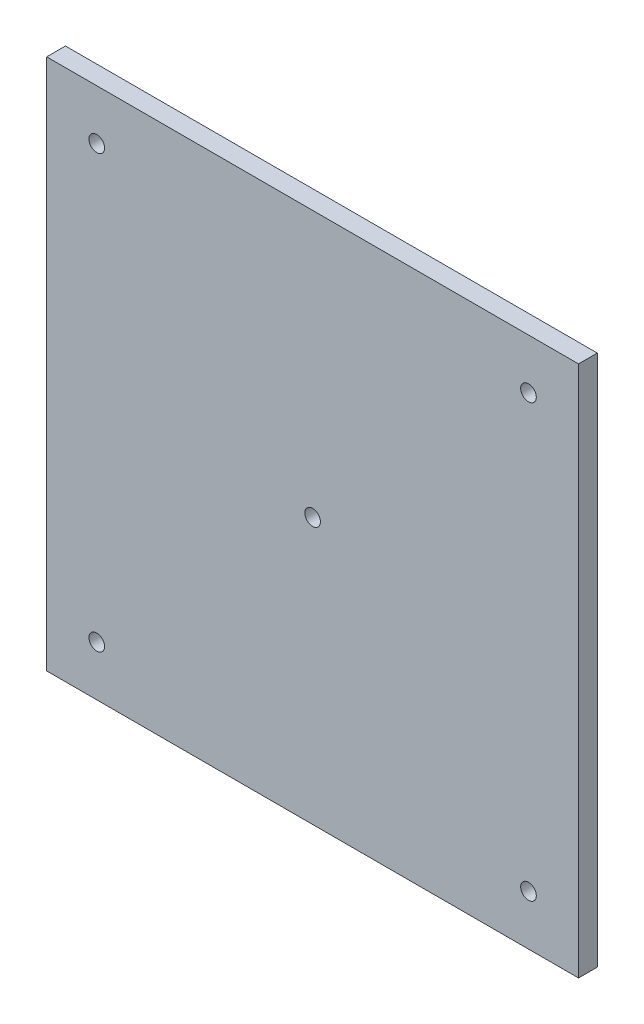
ISO-10303-21;
HEADER;
FILE_DESCRIPTION(('STEP AP214'),'2;1');
FILE_NAME('part.step','',(''),(''),'','','');
FILE_SCHEMA(('AUTOMOTIVE_DESIGN { 1 0 10303 214 1 1 1 1 }'));
ENDSEC;
DATA;
#1=APPLICATION_CONTEXT('core data for automotive mechanical design processes');
#2=APPLICATION_PROTOCOL_DEFINITION('international standard','automotive_design',2000,#1);
#3=PRODUCT_CONTEXT('',#1,'mechanical');
#4=PRODUCT('Part','Part','',(#3));
#5=PRODUCT_RELATED_PRODUCT_CATEGORY('part','',(#4));
#6=PRODUCT_DEFINITION_FORMATION('','',#4);
#7=PRODUCT_DEFINITION_CONTEXT('part definition',#1,'design');
#8=PRODUCT_DEFINITION('design','',#6,#7);
#9=PRODUCT_DEFINITION_SHAPE('','',#8);
#10=(LENGTH_UNIT() NAMED_UNIT(*) SI_UNIT(.MILLI.,.METRE.));
#11=(NAMED_UNIT(*) PLANE_ANGLE_UNIT() SI_UNIT($,.RADIAN.));
#12=(NAMED_UNIT(*) SI_UNIT($,.STERADIAN.) SOLID_ANGLE_UNIT());
#13=UNCERTAINTY_MEASURE_WITH_UNIT(LENGTH_MEASURE(1.E-05),#10,'distance_accuracy_value','');
#14=(GEOMETRIC_REPRESENTATION_CONTEXT(3) GLOBAL_UNCERTAINTY_ASSIGNED_CONTEXT((#13)) GLOBAL_UNIT_ASSIGNED_CONTEXT((#10,
#11,#12)) REPRESENTATION_CONTEXT('',''));
#15=CARTESIAN_POINT('',(0.,0.,0.));
#16=DIRECTION('',(0.,0.,1.));
#17=DIRECTION('',(1.,0.,0.));
#18=AXIS2_PLACEMENT_3D('',#15,#16,#17);
#19=CARTESIAN_POINT('',(-32.6124622832805,19.1999861446117,3.));
#20=DIRECTION('',(1.,0.,0.));
#21=DIRECTION('',(0.,1.,0.));
#22=AXIS2_PLACEMENT_3D('',#19,#20,#21);
#23=PLANE('',#22);
#24=DIRECTION('',(0.,-1.,0.));
#25=VECTOR('',#24,1.);
#26=CARTESIAN_POINT('',(-32.6124622832805,19.1999861446117,0.));
#27=LINE('',#26,#25);
#28=CARTESIAN_POINT('',(-32.6124622832805,19.1999861446117,0.));
#29=VERTEX_POINT('',#28);
#30=CARTESIAN_POINT('',(-32.6124622832805,-65.8000138553883,0.));
#31=VERTEX_POINT('',#30);
#32=EDGE_CURVE('E98',#29,#31,#27,.T.);
#33=ORIENTED_EDGE('',*,*,#32,.T.);
#34=DIRECTION('',(0.,0.,-1.));
#35=VECTOR('',#34,1.);
#36=CARTESIAN_POINT('',(-32.6124622832805,-65.8000138553883,3.));
#37=LINE('',#36,#35);
#38=CARTESIAN_POINT('',(-32.6124622832805,-65.8000138553883,3.));
#39=VERTEX_POINT('',#38);
#40=EDGE_CURVE('E11',#39,#31,#37,.T.);
#41=ORIENTED_EDGE('',*,*,#40,.F.);
#42=DIRECTION('',(0.,-1.,0.));
#43=VECTOR('',#42,1.);
#44=CARTESIAN_POINT('',(-32.6124622832805,19.1999861446117,3.));
#45=LINE('',#44,#43);
#46=CARTESIAN_POINT('',(-32.6124622832805,19.1999861446117,3.));
#47=VERTEX_POINT('',#46);
#48=EDGE_CURVE('E85',#47,#39,#45,.T.);
#49=ORIENTED_EDGE('',*,*,#48,.F.);
#50=DIRECTION('',(0.,0.,-1.));
#51=VECTOR('',#50,1.);
#52=CARTESIAN_POINT('',(-32.6124622832805,19.1999861446117,3.));
#53=LINE('',#52,#51);
#54=EDGE_CURVE('E94',#47,#29,#53,.T.);
#55=ORIENTED_EDGE('',*,*,#54,.T.);
#56=EDGE_LOOP('',(#33,#41,#49,#55));
#57=FACE_BOUND('',#56,.T.);
#58=ADVANCED_FACE('F33',(#57),#23,.F.);
#59=CARTESIAN_POINT('',(-32.6124622832805,-65.8000138553883,3.));
#60=DIRECTION('',(0.,1.,0.));
#61=DIRECTION('',(0.,0.,1.));
#62=AXIS2_PLACEMENT_3D('',#59,#60,#61);
#63=PLANE('',#62);
#64=DIRECTION('',(1.,0.,0.));
#65=VECTOR('',#64,1.);
#66=CARTESIAN_POINT('',(-32.6124622832805,-65.8000138553883,0.));
#67=LINE('',#66,#65);
#68=CARTESIAN_POINT('',(52.3875377167195,-65.8000138553883,0.));
#69=VERTEX_POINT('',#68);
#70=EDGE_CURVE('E89',#31,#69,#67,.T.);
#71=ORIENTED_EDGE('',*,*,#70,.T.);
#72=DIRECTION('',(0.,0.,-1.));
#73=VECTOR('',#72,1.);
#74=CARTESIAN_POINT('',(52.3875377167195,-65.8000138553883,3.));
#75=LINE('',#74,#73);
#76=CARTESIAN_POINT('',(52.3875377167195,-65.8000138553883,3.));
#77=VERTEX_POINT('',#76);
#78=EDGE_CURVE('E42',#77,#69,#75,.T.);
#79=ORIENTED_EDGE('',*,*,#78,.F.);
#80=DIRECTION('',(1.,0.,0.));
#81=VECTOR('',#80,1.);
#82=CARTESIAN_POINT('',(-32.6124622832805,-65.8000138553883,3.));
#83=LINE('',#82,#81);
#84=EDGE_CURVE('E80',#39,#77,#83,.T.);
#85=ORIENTED_EDGE('',*,*,#84,.F.);
#86=ORIENTED_EDGE('',*,*,#40,.T.);
#87=EDGE_LOOP('',(#71,#79,#85,#86));
#88=FACE_BOUND('',#87,.T.);
#89=ADVANCED_FACE('F88',(#88),#63,.F.);
#90=CARTESIAN_POINT('',(52.3875377167195,19.1999861446117,3.));
#91=DIRECTION('',(-1.,0.,0.));
#92=DIRECTION('',(0.,-1.,0.));
#93=AXIS2_PLACEMENT_3D('',#90,#91,#92);
#94=PLANE('',#93);
#95=DIRECTION('',(0.,1.,0.));
#96=VECTOR('',#95,1.);
#97=CARTESIAN_POINT('',(52.3875377167195,19.1999861446117,0.));
#98=LINE('',#97,#96);
#99=CARTESIAN_POINT('',(52.3875377167195,19.1999861446117,0.));
#100=VERTEX_POINT('',#99);
#101=EDGE_CURVE('E67',#69,#100,#98,.T.);
#102=ORIENTED_EDGE('',*,*,#101,.T.);
#103=DIRECTION('',(0.,0.,-1.));
#104=VECTOR('',#103,1.);
#105=CARTESIAN_POINT('',(52.3875377167195,19.1999861446117,3.));
#106=LINE('',#105,#104);
#107=CARTESIAN_POINT('',(52.3875377167195,19.1999861446117,3.));
#108=VERTEX_POINT('',#107);
#109=EDGE_CURVE('E90',#108,#100,#106,.T.);
#110=ORIENTED_EDGE('',*,*,#109,.F.);
#111=DIRECTION('',(0.,1.,0.));
#112=VECTOR('',#111,1.);
#113=CARTESIAN_POINT('',(52.3875377167195,19.1999861446117,3.));
#114=LINE('',#113,#112);
#115=EDGE_CURVE('E83',#77,#108,#114,.T.);
#116=ORIENTED_EDGE('',*,*,#115,.F.);
#117=ORIENTED_EDGE('',*,*,#78,.T.);
#118=EDGE_LOOP('',(#102,#110,#116,#117));
#119=FACE_BOUND('',#118,.T.);
#120=ADVANCED_FACE('F92',(#119),#94,.F.);
#121=CARTESIAN_POINT('',(-32.6124622832805,19.1999861446117,3.));
#122=DIRECTION('',(0.,-1.,0.));
#123=DIRECTION('',(0.,0.,-1.));
#124=AXIS2_PLACEMENT_3D('',#121,#122,#123);
#125=PLANE('',#124);
#126=DIRECTION('',(-1.,0.,0.));
#127=VECTOR('',#126,1.);
#128=CARTESIAN_POINT('',(-32.6124622832805,19.1999861446117,0.));
#129=LINE('',#128,#127);
#130=EDGE_CURVE('E73',#100,#29,#129,.T.);
#131=ORIENTED_EDGE('',*,*,#130,.T.);
#132=ORIENTED_EDGE('',*,*,#54,.F.);
#133=DIRECTION('',(-1.,0.,0.));
#134=VECTOR('',#133,1.);
#135=CARTESIAN_POINT('',(-32.6124622832805,19.1999861446117,3.));
#136=LINE('',#135,#134);
#137=EDGE_CURVE('E50',#108,#47,#136,.T.);
#138=ORIENTED_EDGE('',*,*,#137,.F.);
#139=ORIENTED_EDGE('',*,*,#109,.T.);
#140=EDGE_LOOP('',(#131,#132,#138,#139));
#141=FACE_BOUND('',#140,.T.);
#142=ADVANCED_FACE('F106',(#141),#125,.F.);
#143=CARTESIAN_POINT('',(0.,0.,3.));
#144=DIRECTION('',(0.,0.,1.));
#145=DIRECTION('',(1.,0.,0.));
#146=AXIS2_PLACEMENT_3D('',#143,#144,#145);
#147=PLANE('',#146);
#148=CARTESIAN_POINT('',(9.88753771671948,-23.3000138553883,3.));
#149=DIRECTION('',(0.,0.,1.));
#150=DIRECTION('',(1.,0.,0.));
#151=AXIS2_PLACEMENT_3D('',#148,#149,#150);
#152=CIRCLE('',#151,1.25);
#153=CARTESIAN_POINT('',(11.1375377167195,-23.3000138553883,3.));
#154=VERTEX_POINT('',#153);
#155=EDGE_CURVE('E135',#154,#154,#152,.T.);
#156=ORIENTED_EDGE('',*,*,#155,.F.);
#157=EDGE_LOOP('',(#156));
#158=FACE_BOUND('',#157,.T.);
#159=CARTESIAN_POINT('',(44.3875377167195,-57.8000138553883,3.));
#160=DIRECTION('',(0.,0.,1.));
#161=DIRECTION('',(1.,0.,0.));
#162=AXIS2_PLACEMENT_3D('',#159,#160,#161);
#163=CIRCLE('',#162,1.25);
#164=CARTESIAN_POINT('',(45.6375377167195,-57.8000138553883,3.));
#165=VERTEX_POINT('',#164);
#166=EDGE_CURVE('E130',#165,#165,#163,.T.);
#167=ORIENTED_EDGE('',*,*,#166,.F.);
#168=EDGE_LOOP('',(#167));
#169=FACE_BOUND('',#168,.T.);
#170=CARTESIAN_POINT('',(-24.6124622832805,-57.8000138553883,3.));
#171=DIRECTION('',(0.,0.,1.));
#172=DIRECTION('',(1.,0.,0.));
#173=AXIS2_PLACEMENT_3D('',#170,#171,#172);
#174=CIRCLE('',#173,1.25);
#175=CARTESIAN_POINT('',(-23.3624622832805,-57.8000138553883,3.));
#176=VERTEX_POINT('',#175);
#177=EDGE_CURVE('E124',#176,#176,#174,.T.);
#178=ORIENTED_EDGE('',*,*,#177,.F.);
#179=EDGE_LOOP('',(#178));
#180=FACE_BOUND('',#179,.T.);
#181=CARTESIAN_POINT('',(44.3875377167195,11.1999861446117,3.));
#182=DIRECTION('',(0.,0.,1.));
#183=DIRECTION('',(1.,0.,0.));
#184=AXIS2_PLACEMENT_3D('',#181,#182,#183);
#185=CIRCLE('',#184,1.25);
#186=CARTESIAN_POINT('',(45.6375377167195,11.1999861446117,3.));
#187=VERTEX_POINT('',#186);
#188=EDGE_CURVE('E118',#187,#187,#185,.T.);
#189=ORIENTED_EDGE('',*,*,#188,.F.);
#190=EDGE_LOOP('',(#189));
#191=FACE_BOUND('',#190,.T.);
#192=CARTESIAN_POINT('',(-24.6124622832805,11.1999861446117,3.));
#193=DIRECTION('',(0.,0.,1.));
#194=DIRECTION('',(1.,0.,0.));
#195=AXIS2_PLACEMENT_3D('',#192,#193,#194);
#196=CIRCLE('',#195,1.25);
#197=CARTESIAN_POINT('',(-23.3624622832805,11.1999861446117,3.));
#198=VERTEX_POINT('',#197);
#199=EDGE_CURVE('E112',#198,#198,#196,.T.);
#200=ORIENTED_EDGE('',*,*,#199,.F.);
#201=EDGE_LOOP('',(#200));
#202=FACE_BOUND('',#201,.T.);
#203=ORIENTED_EDGE('',*,*,#48,.T.);
#204=ORIENTED_EDGE('',*,*,#84,.T.);
#205=ORIENTED_EDGE('',*,*,#115,.T.);
#206=ORIENTED_EDGE('',*,*,#137,.T.);
#207=EDGE_LOOP('',(#203,#204,#205,#206));
#208=FACE_BOUND('',#207,.T.);
#209=ADVANCED_FACE('F81',(#158,#169,#180,#191,#202,#208),#147,.T.);
#210=CARTESIAN_POINT('',(0.,0.,0.));
#211=DIRECTION('',(0.,0.,1.));
#212=DIRECTION('',(1.,0.,0.));
#213=AXIS2_PLACEMENT_3D('',#210,#211,#212);
#214=PLANE('',#213);
#215=CARTESIAN_POINT('',(9.88753771671948,-23.3000138553883,0.));
#216=DIRECTION('',(0.,0.,1.));
#217=DIRECTION('',(1.,0.,0.));
#218=AXIS2_PLACEMENT_3D('',#215,#216,#217);
#219=CIRCLE('',#218,1.25);
#220=CARTESIAN_POINT('',(11.1375377167195,-23.3000138553883,0.));
#221=VERTEX_POINT('',#220);
#222=EDGE_CURVE('E36',#221,#221,#219,.T.);
#223=ORIENTED_EDGE('',*,*,#222,.T.);
#224=EDGE_LOOP('',(#223));
#225=FACE_BOUND('',#224,.T.);
#226=CARTESIAN_POINT('',(44.3875377167195,-57.8000138553883,0.));
#227=DIRECTION('',(0.,0.,1.));
#228=DIRECTION('',(1.,0.,0.));
#229=AXIS2_PLACEMENT_3D('',#226,#227,#228);
#230=CIRCLE('',#229,1.25);
#231=CARTESIAN_POINT('',(45.6375377167195,-57.8000138553883,0.));
#232=VERTEX_POINT('',#231);
#233=EDGE_CURVE('E127',#232,#232,#230,.T.);
#234=ORIENTED_EDGE('',*,*,#233,.T.);
#235=EDGE_LOOP('',(#234));
#236=FACE_BOUND('',#235,.T.);
#237=CARTESIAN_POINT('',(-24.6124622832805,-57.8000138553883,0.));
#238=DIRECTION('',(0.,0.,1.));
#239=DIRECTION('',(1.,0.,0.));
#240=AXIS2_PLACEMENT_3D('',#237,#238,#239);
#241=CIRCLE('',#240,1.25);
#242=CARTESIAN_POINT('',(-23.3624622832805,-57.8000138553883,0.));
#243=VERTEX_POINT('',#242);
#244=EDGE_CURVE('E121',#243,#243,#241,.T.);
#245=ORIENTED_EDGE('',*,*,#244,.T.);
#246=EDGE_LOOP('',(#245));
#247=FACE_BOUND('',#246,.T.);
#248=CARTESIAN_POINT('',(44.3875377167195,11.1999861446117,0.));
#249=DIRECTION('',(0.,0.,1.));
#250=DIRECTION('',(1.,0.,0.));
#251=AXIS2_PLACEMENT_3D('',#248,#249,#250);
#252=CIRCLE('',#251,1.25);
#253=CARTESIAN_POINT('',(45.6375377167195,11.1999861446117,0.));
#254=VERTEX_POINT('',#253);
#255=EDGE_CURVE('E115',#254,#254,#252,.T.);
#256=ORIENTED_EDGE('',*,*,#255,.T.);
#257=EDGE_LOOP('',(#256));
#258=FACE_BOUND('',#257,.T.);
#259=CARTESIAN_POINT('',(-24.6124622832805,11.1999861446117,0.));
#260=DIRECTION('',(0.,0.,1.));
#261=DIRECTION('',(1.,0.,0.));
#262=AXIS2_PLACEMENT_3D('',#259,#260,#261);
#263=CIRCLE('',#262,1.25);
#264=CARTESIAN_POINT('',(-23.3624622832805,11.1999861446117,0.));
#265=VERTEX_POINT('',#264);
#266=EDGE_CURVE('E101',#265,#265,#263,.T.);
#267=ORIENTED_EDGE('',*,*,#266,.T.);
#268=EDGE_LOOP('',(#267));
#269=FACE_BOUND('',#268,.T.);
#270=ORIENTED_EDGE('',*,*,#32,.F.);
#271=ORIENTED_EDGE('',*,*,#130,.F.);
#272=ORIENTED_EDGE('',*,*,#101,.F.);
#273=ORIENTED_EDGE('',*,*,#70,.F.);
#274=EDGE_LOOP('',(#270,#271,#272,#273));
#275=FACE_BOUND('',#274,.T.);
#276=ADVANCED_FACE('F109',(#225,#236,#247,#258,#269,#275),#214,.F.);
#277=CARTESIAN_POINT('',(-24.6124622832805,11.1999861446117,0.));
#278=DIRECTION('',(0.,0.,1.));
#279=DIRECTION('',(1.,0.,0.));
#280=AXIS2_PLACEMENT_3D('',#277,#278,#279);
#281=CYLINDRICAL_SURFACE('',#280,1.25);
#282=ORIENTED_EDGE('',*,*,#266,.F.);
#283=EDGE_LOOP('',(#282));
#284=FACE_BOUND('',#283,.T.);
#285=ORIENTED_EDGE('',*,*,#199,.T.);
#286=EDGE_LOOP('',(#285));
#287=FACE_BOUND('',#286,.T.);
#288=ADVANCED_FACE('F167',(#284,#287),#281,.F.);
#289=CARTESIAN_POINT('',(44.3875377167195,11.1999861446117,0.));
#290=DIRECTION('',(0.,0.,1.));
#291=DIRECTION('',(1.,0.,0.));
#292=AXIS2_PLACEMENT_3D('',#289,#290,#291);
#293=CYLINDRICAL_SURFACE('',#292,1.25);
#294=ORIENTED_EDGE('',*,*,#255,.F.);
#295=EDGE_LOOP('',(#294));
#296=FACE_BOUND('',#295,.T.);
#297=ORIENTED_EDGE('',*,*,#188,.T.);
#298=EDGE_LOOP('',(#297));
#299=FACE_BOUND('',#298,.T.);
#300=ADVANCED_FACE('F173',(#296,#299),#293,.F.);
#301=CARTESIAN_POINT('',(-24.6124622832805,-57.8000138553883,0.));
#302=DIRECTION('',(0.,0.,1.));
#303=DIRECTION('',(1.,0.,0.));
#304=AXIS2_PLACEMENT_3D('',#301,#302,#303);
#305=CYLINDRICAL_SURFACE('',#304,1.25);
#306=ORIENTED_EDGE('',*,*,#244,.F.);
#307=EDGE_LOOP('',(#306));
#308=FACE_BOUND('',#307,.T.);
#309=ORIENTED_EDGE('',*,*,#177,.T.);
#310=EDGE_LOOP('',(#309));
#311=FACE_BOUND('',#310,.T.);
#312=ADVANCED_FACE('F151',(#308,#311),#305,.F.);
#313=CARTESIAN_POINT('',(44.3875377167195,-57.8000138553883,0.));
#314=DIRECTION('',(0.,0.,1.));
#315=DIRECTION('',(1.,0.,0.));
#316=AXIS2_PLACEMENT_3D('',#313,#314,#315);
#317=CYLINDRICAL_SURFACE('',#316,1.25);
#318=ORIENTED_EDGE('',*,*,#233,.F.);
#319=EDGE_LOOP('',(#318));
#320=FACE_BOUND('',#319,.T.);
#321=ORIENTED_EDGE('',*,*,#166,.T.);
#322=EDGE_LOOP('',(#321));
#323=FACE_BOUND('',#322,.T.);
#324=ADVANCED_FACE('F146',(#320,#323),#317,.F.);
#325=CARTESIAN_POINT('',(9.88753771671948,-23.3000138553883,-7.));
#326=DIRECTION('',(0.,0.,1.));
#327=DIRECTION('',(1.,0.,0.));
#328=AXIS2_PLACEMENT_3D('',#325,#326,#327);
#329=CYLINDRICAL_SURFACE('',#328,1.25);
#330=ORIENTED_EDGE('',*,*,#155,.T.);
#331=EDGE_LOOP('',(#330));
#332=FACE_BOUND('',#331,.T.);
#333=ORIENTED_EDGE('',*,*,#222,.F.);
#334=EDGE_LOOP('',(#333));
#335=FACE_BOUND('',#334,.T.);
#336=ADVANCED_FACE('F144',(#332,#335),#329,.F.);
#337=CLOSED_SHELL('',(#58,#89,#120,#142,#209,#276,#288,#300,#312,#324,#336));
#338=MANIFOLD_SOLID_BREP('B2',#337);
#339=ADVANCED_BREP_SHAPE_REPRESENTATION('',(#18,#338),#14);
#340=SHAPE_DEFINITION_REPRESENTATION(#9,#339);
ENDSEC;
END-ISO-10303-21;
